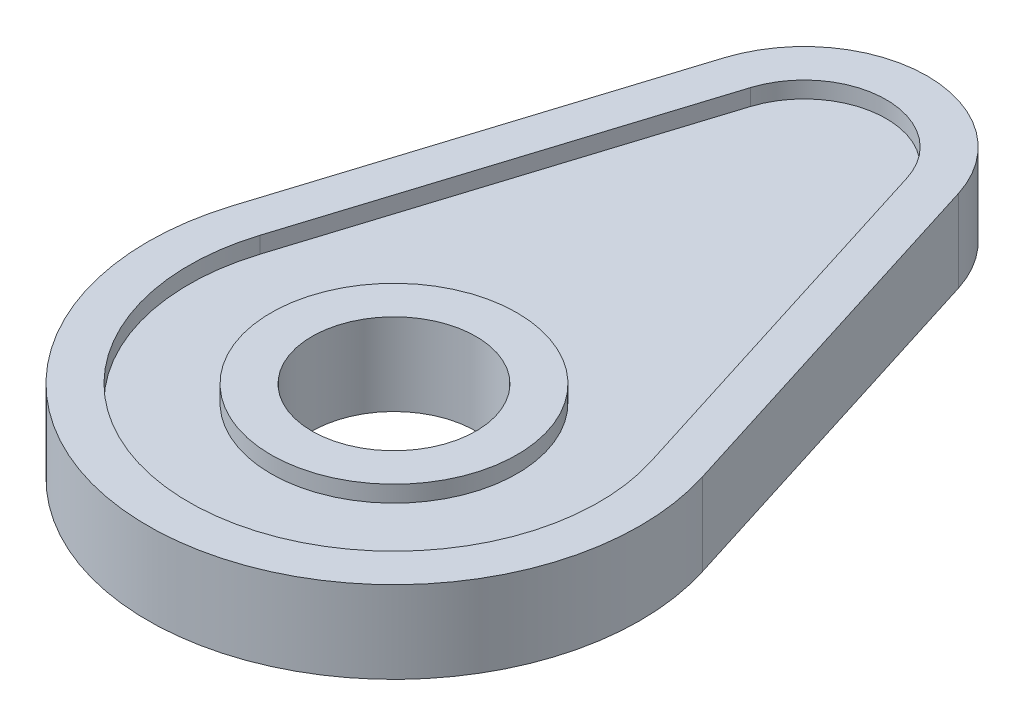
ISO-10303-21;
HEADER;
FILE_DESCRIPTION(('STEP AP214'),'2;1');
FILE_NAME('part.step','',(''),(''),'','','');
FILE_SCHEMA(('AUTOMOTIVE_DESIGN { 1 0 10303 214 1 1 1 1 }'));
ENDSEC;
DATA;
#1=APPLICATION_CONTEXT('core data for automotive mechanical design processes');
#2=APPLICATION_PROTOCOL_DEFINITION('international standard','automotive_design',2000,#1);
#3=PRODUCT_CONTEXT('',#1,'mechanical');
#4=PRODUCT('Part','Part','',(#3));
#5=PRODUCT_RELATED_PRODUCT_CATEGORY('part','',(#4));
#6=PRODUCT_DEFINITION_FORMATION('','',#4);
#7=PRODUCT_DEFINITION_CONTEXT('part definition',#1,'design');
#8=PRODUCT_DEFINITION('design','',#6,#7);
#9=PRODUCT_DEFINITION_SHAPE('','',#8);
#10=(LENGTH_UNIT() NAMED_UNIT(*) SI_UNIT(.MILLI.,.METRE.));
#11=(NAMED_UNIT(*) PLANE_ANGLE_UNIT() SI_UNIT($,.RADIAN.));
#12=(NAMED_UNIT(*) SI_UNIT($,.STERADIAN.) SOLID_ANGLE_UNIT());
#13=UNCERTAINTY_MEASURE_WITH_UNIT(LENGTH_MEASURE(1.E-05),#10,'distance_accuracy_value','');
#14=(GEOMETRIC_REPRESENTATION_CONTEXT(3) GLOBAL_UNCERTAINTY_ASSIGNED_CONTEXT((#13)) GLOBAL_UNIT_ASSIGNED_CONTEXT((#10,
#11,#12)) REPRESENTATION_CONTEXT('',''));
#15=CARTESIAN_POINT('',(0.,0.,0.));
#16=DIRECTION('',(0.,0.,1.));
#17=DIRECTION('',(1.,0.,0.));
#18=AXIS2_PLACEMENT_3D('',#15,#16,#17);
#19=CARTESIAN_POINT('',(0.,3.,-50.));
#20=DIRECTION('',(0.,1.,0.));
#21=DIRECTION('',(0.,0.,1.));
#22=AXIS2_PLACEMENT_3D('',#19,#20,#21);
#23=PLANE('',#22);
#24=CARTESIAN_POINT('',(0.,3.,-50.));
#25=DIRECTION('',(0.,1.,0.));
#26=DIRECTION('',(0.,0.,1.));
#27=AXIS2_PLACEMENT_3D('',#24,#25,#26);
#28=CIRCLE('',#27,9.99999999999999);
#29=CARTESIAN_POINT('',(9.53939201416946,3.,-53.));
#30=VERTEX_POINT('',#29);
#31=CARTESIAN_POINT('',(-9.53939201416946,3.,-53.));
#32=VERTEX_POINT('',#31);
#33=EDGE_CURVE('E185',#30,#32,#28,.T.);
#34=ORIENTED_EDGE('',*,*,#33,.T.);
#35=DIRECTION('',(-0.3,0.,0.953939201416946));
#36=VECTOR('',#35,1.);
#37=CARTESIAN_POINT('',(-9.53939201416946,3.,-53.));
#38=LINE('',#37,#36);
#39=CARTESIAN_POINT('',(-23.8484800354236,3.,-7.50000000000001));
#40=VERTEX_POINT('',#39);
#41=EDGE_CURVE('E189',#32,#40,#38,.T.);
#42=ORIENTED_EDGE('',*,*,#41,.T.);
#43=CARTESIAN_POINT('',(0.,3.,0.));
#44=DIRECTION('',(0.,1.,0.));
#45=DIRECTION('',(0.,0.,1.));
#46=AXIS2_PLACEMENT_3D('',#43,#44,#45);
#47=CIRCLE('',#46,25.);
#48=CARTESIAN_POINT('',(23.8484800354236,3.,-7.5));
#49=VERTEX_POINT('',#48);
#50=EDGE_CURVE('E194',#40,#49,#47,.T.);
#51=ORIENTED_EDGE('',*,*,#50,.T.);
#52=DIRECTION('',(-0.3,0.,-0.953939201416946));
#53=VECTOR('',#52,1.);
#54=CARTESIAN_POINT('',(23.8484800354236,3.,-7.50000000000001));
#55=LINE('',#54,#53);
#56=EDGE_CURVE('E198',#49,#30,#55,.T.);
#57=ORIENTED_EDGE('',*,*,#56,.T.);
#58=EDGE_LOOP('',(#34,#42,#51,#57));
#59=FACE_BOUND('',#58,.T.);
#60=CARTESIAN_POINT('',(0.,3.,0.));
#61=DIRECTION('',(0.,1.,0.));
#62=DIRECTION('',(0.,0.,1.));
#63=AXIS2_PLACEMENT_3D('',#60,#61,#62);
#64=CIRCLE('',#63,15.);
#65=CARTESIAN_POINT('',(0.,3.,15.));
#66=VERTEX_POINT('',#65);
#67=EDGE_CURVE('E161',#66,#66,#64,.T.);
#68=ORIENTED_EDGE('',*,*,#67,.F.);
#69=EDGE_LOOP('',(#68));
#70=FACE_BOUND('',#69,.T.);
#71=ADVANCED_FACE('F41',(#59,#70),#23,.T.);
#72=CARTESIAN_POINT('',(0.,-5.,-50.));
#73=DIRECTION('',(0.,1.,0.));
#74=DIRECTION('',(0.,0.,1.));
#75=AXIS2_PLACEMENT_3D('',#72,#73,#74);
#76=PLANE('',#75);
#77=DIRECTION('',(0.3,0.,-0.953939201416946));
#78=VECTOR('',#77,1.);
#79=CARTESIAN_POINT('',(-28.6181760425084,-5.,-9.));
#80=LINE('',#79,#78);
#81=CARTESIAN_POINT('',(-28.6181760425084,-5.,-9.00000000000001));
#82=VERTEX_POINT('',#81);
#83=CARTESIAN_POINT('',(-14.3090880212542,-5.,-54.5));
#84=VERTEX_POINT('',#83);
#85=EDGE_CURVE('E228',#82,#84,#80,.T.);
#86=ORIENTED_EDGE('',*,*,#85,.T.);
#87=CARTESIAN_POINT('',(0.,-5.,-50.));
#88=DIRECTION('',(0.,1.,0.));
#89=DIRECTION('',(0.,0.,1.));
#90=AXIS2_PLACEMENT_3D('',#87,#88,#89);
#91=CIRCLE('',#90,15.);
#92=CARTESIAN_POINT('',(14.3090880212542,-5.,-54.5));
#93=VERTEX_POINT('',#92);
#94=EDGE_CURVE('E231',#93,#84,#91,.T.);
#95=ORIENTED_EDGE('',*,*,#94,.F.);
#96=DIRECTION('',(0.3,0.,0.953939201416946));
#97=VECTOR('',#96,1.);
#98=CARTESIAN_POINT('',(14.3090880212542,-5.,-54.5));
#99=LINE('',#98,#97);
#100=CARTESIAN_POINT('',(28.6181760425084,-5.,-9.));
#101=VERTEX_POINT('',#100);
#102=EDGE_CURVE('E236',#93,#101,#99,.T.);
#103=ORIENTED_EDGE('',*,*,#102,.T.);
#104=CARTESIAN_POINT('',(0.,-5.,0.));
#105=DIRECTION('',(0.,1.,0.));
#106=DIRECTION('',(0.,0.,1.));
#107=AXIS2_PLACEMENT_3D('',#104,#105,#106);
#108=CIRCLE('',#107,30.);
#109=EDGE_CURVE('E239',#82,#101,#108,.T.);
#110=ORIENTED_EDGE('',*,*,#109,.F.);
#111=EDGE_LOOP('',(#86,#95,#103,#110));
#112=FACE_BOUND('',#111,.T.);
#113=CARTESIAN_POINT('',(0.,-5.,-50.));
#114=DIRECTION('',(0.,1.,0.));
#115=DIRECTION('',(0.,0.,1.));
#116=AXIS2_PLACEMENT_3D('',#113,#114,#115);
#117=CIRCLE('',#116,9.99999999999999);
#118=CARTESIAN_POINT('',(9.53939201416946,-5.,-53.));
#119=VERTEX_POINT('',#118);
#120=CARTESIAN_POINT('',(-9.53939201416946,-5.,-53.));
#121=VERTEX_POINT('',#120);
#122=EDGE_CURVE('E57',#119,#121,#117,.T.);
#123=ORIENTED_EDGE('',*,*,#122,.T.);
#124=DIRECTION('',(-0.3,0.,0.953939201416946));
#125=VECTOR('',#124,1.);
#126=CARTESIAN_POINT('',(-9.53939201416946,-5.,-53.));
#127=LINE('',#126,#125);
#128=CARTESIAN_POINT('',(-23.8484800354236,-5.,-7.50000000000001));
#129=VERTEX_POINT('',#128);
#130=EDGE_CURVE('E154',#121,#129,#127,.T.);
#131=ORIENTED_EDGE('',*,*,#130,.T.);
#132=CARTESIAN_POINT('',(0.,-5.,0.));
#133=DIRECTION('',(0.,1.,0.));
#134=DIRECTION('',(0.,0.,1.));
#135=AXIS2_PLACEMENT_3D('',#132,#133,#134);
#136=CIRCLE('',#135,25.);
#137=CARTESIAN_POINT('',(23.8484800354236,-5.,-7.5));
#138=VERTEX_POINT('',#137);
#139=EDGE_CURVE('E158',#129,#138,#136,.T.);
#140=ORIENTED_EDGE('',*,*,#139,.T.);
#141=DIRECTION('',(-0.3,0.,-0.953939201416946));
#142=VECTOR('',#141,1.);
#143=CARTESIAN_POINT('',(23.8484800354236,-5.,-7.50000000000001));
#144=LINE('',#143,#142);
#145=EDGE_CURVE('E170',#138,#119,#144,.T.);
#146=ORIENTED_EDGE('',*,*,#145,.T.);
#147=EDGE_LOOP('',(#123,#131,#140,#146));
#148=FACE_BOUND('',#147,.T.);
#149=ADVANCED_FACE('F284',(#112,#148),#76,.F.);
#150=CARTESIAN_POINT('',(-28.6181760425084,-5.,-9.));
#151=DIRECTION('',(0.953939201416946,0.,0.3));
#152=DIRECTION('',(0.3,0.,-0.953939201416946));
#153=AXIS2_PLACEMENT_3D('',#150,#151,#152);
#154=PLANE('',#153);
#155=DIRECTION('',(0.3,0.,-0.953939201416946));
#156=VECTOR('',#155,1.);
#157=CARTESIAN_POINT('',(-28.6181760425084,5.,-9.));
#158=LINE('',#157,#156);
#159=CARTESIAN_POINT('',(-28.6181760425084,5.,-9.00000000000001));
#160=VERTEX_POINT('',#159);
#161=CARTESIAN_POINT('',(-14.3090880212542,5.,-54.5));
#162=VERTEX_POINT('',#161);
#163=EDGE_CURVE('E219',#160,#162,#158,.T.);
#164=ORIENTED_EDGE('',*,*,#163,.T.);
#165=DIRECTION('',(0.,1.,0.));
#166=VECTOR('',#165,1.);
#167=CARTESIAN_POINT('',(-14.3090880212542,-5.,-54.5));
#168=LINE('',#167,#166);
#169=EDGE_CURVE('E50',#84,#162,#168,.T.);
#170=ORIENTED_EDGE('',*,*,#169,.F.);
#171=ORIENTED_EDGE('',*,*,#85,.F.);
#172=DIRECTION('',(0.,1.,0.));
#173=VECTOR('',#172,1.);
#174=CARTESIAN_POINT('',(-28.6181760425084,-5.,-9.00000000000001));
#175=LINE('',#174,#173);
#176=EDGE_CURVE('E243',#82,#160,#175,.T.);
#177=ORIENTED_EDGE('',*,*,#176,.T.);
#178=EDGE_LOOP('',(#164,#170,#171,#177));
#179=FACE_BOUND('',#178,.T.);
#180=ADVANCED_FACE('F43',(#179),#154,.F.);
#181=CARTESIAN_POINT('',(0.,-5.,-50.));
#182=DIRECTION('',(0.,1.,0.));
#183=DIRECTION('',(0.,0.,1.));
#184=AXIS2_PLACEMENT_3D('',#181,#182,#183);
#185=CYLINDRICAL_SURFACE('',#184,15.);
#186=CARTESIAN_POINT('',(0.,5.,-50.));
#187=DIRECTION('',(0.,1.,0.));
#188=DIRECTION('',(0.,0.,1.));
#189=AXIS2_PLACEMENT_3D('',#186,#187,#188);
#190=CIRCLE('',#189,15.);
#191=CARTESIAN_POINT('',(14.3090880212542,5.,-54.5));
#192=VERTEX_POINT('',#191);
#193=EDGE_CURVE('E247',#192,#162,#190,.T.);
#194=ORIENTED_EDGE('',*,*,#193,.F.);
#195=DIRECTION('',(0.,1.,0.));
#196=VECTOR('',#195,1.);
#197=CARTESIAN_POINT('',(14.3090880212542,-5.,-54.5));
#198=LINE('',#197,#196);
#199=EDGE_CURVE('E263',#93,#192,#198,.T.);
#200=ORIENTED_EDGE('',*,*,#199,.F.);
#201=ORIENTED_EDGE('',*,*,#94,.T.);
#202=ORIENTED_EDGE('',*,*,#169,.T.);
#203=EDGE_LOOP('',(#194,#200,#201,#202));
#204=FACE_BOUND('',#203,.T.);
#205=ADVANCED_FACE('F269',(#204),#185,.T.);
#206=CARTESIAN_POINT('',(14.3090880212542,-5.,-54.5));
#207=DIRECTION('',(-0.953939201416946,0.,0.3));
#208=DIRECTION('',(0.3,0.,0.953939201416946));
#209=AXIS2_PLACEMENT_3D('',#206,#207,#208);
#210=PLANE('',#209);
#211=DIRECTION('',(0.3,0.,0.953939201416946));
#212=VECTOR('',#211,1.);
#213=CARTESIAN_POINT('',(14.3090880212542,5.,-54.5));
#214=LINE('',#213,#212);
#215=CARTESIAN_POINT('',(28.6181760425084,5.,-9.));
#216=VERTEX_POINT('',#215);
#217=EDGE_CURVE('E251',#192,#216,#214,.T.);
#218=ORIENTED_EDGE('',*,*,#217,.T.);
#219=DIRECTION('',(0.,1.,0.));
#220=VECTOR('',#219,1.);
#221=CARTESIAN_POINT('',(28.6181760425084,-5.,-9.));
#222=LINE('',#221,#220);
#223=EDGE_CURVE('E260',#101,#216,#222,.T.);
#224=ORIENTED_EDGE('',*,*,#223,.F.);
#225=ORIENTED_EDGE('',*,*,#102,.F.);
#226=ORIENTED_EDGE('',*,*,#199,.T.);
#227=EDGE_LOOP('',(#218,#224,#225,#226));
#228=FACE_BOUND('',#227,.T.);
#229=ADVANCED_FACE('F280',(#228),#210,.F.);
#230=CARTESIAN_POINT('',(0.,-5.,0.));
#231=DIRECTION('',(0.,1.,0.));
#232=DIRECTION('',(0.,0.,1.));
#233=AXIS2_PLACEMENT_3D('',#230,#231,#232);
#234=CYLINDRICAL_SURFACE('',#233,30.);
#235=CARTESIAN_POINT('',(0.,5.,0.));
#236=DIRECTION('',(0.,1.,0.));
#237=DIRECTION('',(0.,0.,1.));
#238=AXIS2_PLACEMENT_3D('',#235,#236,#237);
#239=CIRCLE('',#238,30.);
#240=EDGE_CURVE('E232',#160,#216,#239,.T.);
#241=ORIENTED_EDGE('',*,*,#240,.F.);
#242=ORIENTED_EDGE('',*,*,#176,.F.);
#243=ORIENTED_EDGE('',*,*,#109,.T.);
#244=ORIENTED_EDGE('',*,*,#223,.T.);
#245=EDGE_LOOP('',(#241,#242,#243,#244));
#246=FACE_BOUND('',#245,.T.);
#247=ADVANCED_FACE('F287',(#246),#234,.T.);
#248=CARTESIAN_POINT('',(0.,5.,-50.));
#249=DIRECTION('',(0.,1.,0.));
#250=DIRECTION('',(0.,0.,1.));
#251=AXIS2_PLACEMENT_3D('',#248,#249,#250);
#252=PLANE('',#251);
#253=CARTESIAN_POINT('',(0.,5.,-50.));
#254=DIRECTION('',(0.,1.,0.));
#255=DIRECTION('',(0.,0.,1.));
#256=AXIS2_PLACEMENT_3D('',#253,#254,#255);
#257=CIRCLE('',#256,9.99999999999999);
#258=CARTESIAN_POINT('',(9.53939201416946,5.,-53.));
#259=VERTEX_POINT('',#258);
#260=CARTESIAN_POINT('',(-9.53939201416946,5.,-53.));
#261=VERTEX_POINT('',#260);
#262=EDGE_CURVE('E65',#259,#261,#257,.T.);
#263=ORIENTED_EDGE('',*,*,#262,.F.);
#264=DIRECTION('',(-0.3,0.,-0.953939201416946));
#265=VECTOR('',#264,1.);
#266=CARTESIAN_POINT('',(23.8484800354236,5.,-7.50000000000001));
#267=LINE('',#266,#265);
#268=CARTESIAN_POINT('',(23.8484800354236,5.,-7.5));
#269=VERTEX_POINT('',#268);
#270=EDGE_CURVE('E190',#269,#259,#267,.T.);
#271=ORIENTED_EDGE('',*,*,#270,.F.);
#272=CARTESIAN_POINT('',(0.,5.,0.));
#273=DIRECTION('',(0.,1.,0.));
#274=DIRECTION('',(0.,0.,1.));
#275=AXIS2_PLACEMENT_3D('',#272,#273,#274);
#276=CIRCLE('',#275,25.);
#277=CARTESIAN_POINT('',(-23.8484800354236,5.,-7.50000000000001));
#278=VERTEX_POINT('',#277);
#279=EDGE_CURVE('E209',#278,#269,#276,.T.);
#280=ORIENTED_EDGE('',*,*,#279,.F.);
#281=DIRECTION('',(-0.3,0.,0.953939201416946));
#282=VECTOR('',#281,1.);
#283=CARTESIAN_POINT('',(-9.53939201416946,5.,-53.));
#284=LINE('',#283,#282);
#285=EDGE_CURVE('E205',#261,#278,#284,.T.);
#286=ORIENTED_EDGE('',*,*,#285,.F.);
#287=EDGE_LOOP('',(#263,#271,#280,#286));
#288=FACE_BOUND('',#287,.T.);
#289=ORIENTED_EDGE('',*,*,#163,.F.);
#290=ORIENTED_EDGE('',*,*,#240,.T.);
#291=ORIENTED_EDGE('',*,*,#217,.F.);
#292=ORIENTED_EDGE('',*,*,#193,.T.);
#293=EDGE_LOOP('',(#289,#290,#291,#292));
#294=FACE_BOUND('',#293,.T.);
#295=ADVANCED_FACE('F277',(#288,#294),#252,.T.);
#296=CARTESIAN_POINT('',(0.,3.,-50.));
#297=DIRECTION('',(0.,1.,0.));
#298=DIRECTION('',(0.,0.,1.));
#299=AXIS2_PLACEMENT_3D('',#296,#297,#298);
#300=CYLINDRICAL_SURFACE('',#299,9.99999999999999);
#301=ORIENTED_EDGE('',*,*,#262,.T.);
#302=DIRECTION('',(0.,1.,0.));
#303=VECTOR('',#302,1.);
#304=CARTESIAN_POINT('',(-9.53939201416946,3.,-53.));
#305=LINE('',#304,#303);
#306=EDGE_CURVE('E202',#32,#261,#305,.T.);
#307=ORIENTED_EDGE('',*,*,#306,.F.);
#308=ORIENTED_EDGE('',*,*,#33,.F.);
#309=DIRECTION('',(0.,1.,0.));
#310=VECTOR('',#309,1.);
#311=CARTESIAN_POINT('',(9.53939201416946,3.,-53.));
#312=LINE('',#311,#310);
#313=EDGE_CURVE('E216',#30,#259,#312,.T.);
#314=ORIENTED_EDGE('',*,*,#313,.T.);
#315=EDGE_LOOP('',(#301,#307,#308,#314));
#316=FACE_BOUND('',#315,.T.);
#317=ADVANCED_FACE('F294',(#316),#300,.F.);
#318=CARTESIAN_POINT('',(23.8484800354236,3.,-7.50000000000001));
#319=DIRECTION('',(0.953939201416946,0.,-0.3));
#320=DIRECTION('',(-0.3,0.,-0.953939201416946));
#321=AXIS2_PLACEMENT_3D('',#318,#319,#320);
#322=PLANE('',#321);
#323=ORIENTED_EDGE('',*,*,#270,.T.);
#324=ORIENTED_EDGE('',*,*,#313,.F.);
#325=ORIENTED_EDGE('',*,*,#56,.F.);
#326=DIRECTION('',(0.,1.,0.));
#327=VECTOR('',#326,1.);
#328=CARTESIAN_POINT('',(23.8484800354236,3.,-7.5));
#329=LINE('',#328,#327);
#330=EDGE_CURVE('E220',#49,#269,#329,.T.);
#331=ORIENTED_EDGE('',*,*,#330,.T.);
#332=EDGE_LOOP('',(#323,#324,#325,#331));
#333=FACE_BOUND('',#332,.T.);
#334=ADVANCED_FACE('F309',(#333),#322,.F.);
#335=CARTESIAN_POINT('',(0.,3.,0.));
#336=DIRECTION('',(0.,1.,0.));
#337=DIRECTION('',(0.,0.,1.));
#338=AXIS2_PLACEMENT_3D('',#335,#336,#337);
#339=CYLINDRICAL_SURFACE('',#338,25.);
#340=ORIENTED_EDGE('',*,*,#279,.T.);
#341=ORIENTED_EDGE('',*,*,#330,.F.);
#342=ORIENTED_EDGE('',*,*,#50,.F.);
#343=DIRECTION('',(0.,1.,0.));
#344=VECTOR('',#343,1.);
#345=CARTESIAN_POINT('',(-23.8484800354236,3.,-7.50000000000001));
#346=LINE('',#345,#344);
#347=EDGE_CURVE('E223',#40,#278,#346,.T.);
#348=ORIENTED_EDGE('',*,*,#347,.T.);
#349=EDGE_LOOP('',(#340,#341,#342,#348));
#350=FACE_BOUND('',#349,.T.);
#351=ADVANCED_FACE('F312',(#350),#339,.F.);
#352=CARTESIAN_POINT('',(-9.53939201416946,3.,-53.));
#353=DIRECTION('',(-0.953939201416946,0.,-0.3));
#354=DIRECTION('',(-0.3,0.,0.953939201416946));
#355=AXIS2_PLACEMENT_3D('',#352,#353,#354);
#356=PLANE('',#355);
#357=ORIENTED_EDGE('',*,*,#285,.T.);
#358=ORIENTED_EDGE('',*,*,#347,.F.);
#359=ORIENTED_EDGE('',*,*,#41,.F.);
#360=ORIENTED_EDGE('',*,*,#306,.T.);
#361=EDGE_LOOP('',(#357,#358,#359,#360));
#362=FACE_BOUND('',#361,.T.);
#363=ADVANCED_FACE('F316',(#362),#356,.F.);
#364=CARTESIAN_POINT('',(0.,-3.,-50.));
#365=DIRECTION('',(0.,-1.,0.));
#366=DIRECTION('',(0.,0.,-1.));
#367=AXIS2_PLACEMENT_3D('',#364,#365,#366);
#368=CYLINDRICAL_SURFACE('',#367,9.99999999999999);
#369=ORIENTED_EDGE('',*,*,#122,.F.);
#370=DIRECTION('',(0.,-1.,0.));
#371=VECTOR('',#370,1.);
#372=CARTESIAN_POINT('',(9.53939201416946,-3.,-53.));
#373=LINE('',#372,#371);
#374=CARTESIAN_POINT('',(9.53939201416946,-3.,-53.));
#375=VERTEX_POINT('',#374);
#376=EDGE_CURVE('E136',#375,#119,#373,.T.);
#377=ORIENTED_EDGE('',*,*,#376,.F.);
#378=CARTESIAN_POINT('',(0.,-3.,-50.));
#379=DIRECTION('',(0.,1.,0.));
#380=DIRECTION('',(0.,0.,1.));
#381=AXIS2_PLACEMENT_3D('',#378,#379,#380);
#382=CIRCLE('',#381,9.99999999999999);
#383=CARTESIAN_POINT('',(-9.53939201416946,-3.,-53.));
#384=VERTEX_POINT('',#383);
#385=EDGE_CURVE('E144',#375,#384,#382,.T.);
#386=ORIENTED_EDGE('',*,*,#385,.T.);
#387=DIRECTION('',(0.,-1.,0.));
#388=VECTOR('',#387,1.);
#389=CARTESIAN_POINT('',(-9.53939201416946,-3.,-53.));
#390=LINE('',#389,#388);
#391=EDGE_CURVE('E177',#384,#121,#390,.T.);
#392=ORIENTED_EDGE('',*,*,#391,.T.);
#393=EDGE_LOOP('',(#369,#377,#386,#392));
#394=FACE_BOUND('',#393,.T.);
#395=ADVANCED_FACE('F147',(#394),#368,.F.);
#396=CARTESIAN_POINT('',(-9.53939201416946,-3.,-53.));
#397=DIRECTION('',(0.953939201416946,0.,0.3));
#398=DIRECTION('',(0.3,0.,-0.953939201416946));
#399=AXIS2_PLACEMENT_3D('',#396,#397,#398);
#400=PLANE('',#399);
#401=ORIENTED_EDGE('',*,*,#130,.F.);
#402=ORIENTED_EDGE('',*,*,#391,.F.);
#403=DIRECTION('',(-0.3,0.,0.953939201416946));
#404=VECTOR('',#403,1.);
#405=CARTESIAN_POINT('',(-9.53939201416946,-3.,-53.));
#406=LINE('',#405,#404);
#407=CARTESIAN_POINT('',(-23.8484800354236,-3.,-7.50000000000001));
#408=VERTEX_POINT('',#407);
#409=EDGE_CURVE('E150',#384,#408,#406,.T.);
#410=ORIENTED_EDGE('',*,*,#409,.T.);
#411=DIRECTION('',(0.,-1.,0.));
#412=VECTOR('',#411,1.);
#413=CARTESIAN_POINT('',(-23.8484800354236,-3.,-7.50000000000001));
#414=LINE('',#413,#412);
#415=EDGE_CURVE('E180',#408,#129,#414,.T.);
#416=ORIENTED_EDGE('',*,*,#415,.T.);
#417=EDGE_LOOP('',(#401,#402,#410,#416));
#418=FACE_BOUND('',#417,.T.);
#419=ADVANCED_FACE('F345',(#418),#400,.T.);
#420=CARTESIAN_POINT('',(0.,-3.,0.));
#421=DIRECTION('',(0.,-1.,0.));
#422=DIRECTION('',(0.,0.,-1.));
#423=AXIS2_PLACEMENT_3D('',#420,#421,#422);
#424=CYLINDRICAL_SURFACE('',#423,25.);
#425=ORIENTED_EDGE('',*,*,#139,.F.);
#426=ORIENTED_EDGE('',*,*,#415,.F.);
#427=CARTESIAN_POINT('',(0.,-3.,0.));
#428=DIRECTION('',(0.,1.,0.));
#429=DIRECTION('',(0.,0.,1.));
#430=AXIS2_PLACEMENT_3D('',#427,#428,#429);
#431=CIRCLE('',#430,25.);
#432=CARTESIAN_POINT('',(23.8484800354236,-3.,-7.5));
#433=VERTEX_POINT('',#432);
#434=EDGE_CURVE('E143',#408,#433,#431,.T.);
#435=ORIENTED_EDGE('',*,*,#434,.T.);
#436=DIRECTION('',(0.,-1.,0.));
#437=VECTOR('',#436,1.);
#438=CARTESIAN_POINT('',(23.8484800354236,-3.,-7.5));
#439=LINE('',#438,#437);
#440=EDGE_CURVE('E138',#433,#138,#439,.T.);
#441=ORIENTED_EDGE('',*,*,#440,.T.);
#442=EDGE_LOOP('',(#425,#426,#435,#441));
#443=FACE_BOUND('',#442,.T.);
#444=ADVANCED_FACE('F351',(#443),#424,.F.);
#445=CARTESIAN_POINT('',(23.8484800354236,-3.,-7.50000000000001));
#446=DIRECTION('',(-0.953939201416946,0.,0.3));
#447=DIRECTION('',(0.3,0.,0.953939201416946));
#448=AXIS2_PLACEMENT_3D('',#445,#446,#447);
#449=PLANE('',#448);
#450=ORIENTED_EDGE('',*,*,#145,.F.);
#451=ORIENTED_EDGE('',*,*,#440,.F.);
#452=DIRECTION('',(-0.3,0.,-0.953939201416946));
#453=VECTOR('',#452,1.);
#454=CARTESIAN_POINT('',(23.8484800354236,-3.,-7.50000000000001));
#455=LINE('',#454,#453);
#456=EDGE_CURVE('E133',#433,#375,#455,.T.);
#457=ORIENTED_EDGE('',*,*,#456,.T.);
#458=ORIENTED_EDGE('',*,*,#376,.T.);
#459=EDGE_LOOP('',(#450,#451,#457,#458));
#460=FACE_BOUND('',#459,.T.);
#461=ADVANCED_FACE('F135',(#460),#449,.T.);
#462=CARTESIAN_POINT('',(0.,-3.,-50.));
#463=DIRECTION('',(0.,-1.,0.));
#464=DIRECTION('',(0.,0.,1.));
#465=AXIS2_PLACEMENT_3D('',#462,#463,#464);
#466=PLANE('',#465);
#467=CARTESIAN_POINT('',(0.,-3.,0.));
#468=DIRECTION('',(0.,-1.,0.));
#469=DIRECTION('',(0.,0.,-1.));
#470=AXIS2_PLACEMENT_3D('',#467,#468,#469);
#471=CIRCLE('',#470,15.);
#472=CARTESIAN_POINT('',(0.,-3.,-15.));
#473=VERTEX_POINT('',#472);
#474=EDGE_CURVE('E11',#473,#473,#471,.T.);
#475=ORIENTED_EDGE('',*,*,#474,.F.);
#476=EDGE_LOOP('',(#475));
#477=FACE_BOUND('',#476,.T.);
#478=ORIENTED_EDGE('',*,*,#385,.F.);
#479=ORIENTED_EDGE('',*,*,#456,.F.);
#480=ORIENTED_EDGE('',*,*,#434,.F.);
#481=ORIENTED_EDGE('',*,*,#409,.F.);
#482=EDGE_LOOP('',(#478,#479,#480,#481));
#483=FACE_BOUND('',#482,.T.);
#484=ADVANCED_FACE('F152',(#477,#483),#466,.T.);
#485=CARTESIAN_POINT('',(0.,-5.,0.));
#486=DIRECTION('',(0.,1.,0.));
#487=DIRECTION('',(0.,0.,1.));
#488=AXIS2_PLACEMENT_3D('',#485,#486,#487);
#489=CYLINDRICAL_SURFACE('',#488,10.);
#490=CARTESIAN_POINT('',(0.,5.,0.));
#491=DIRECTION('',(0.,1.,0.));
#492=DIRECTION('',(0.,0.,1.));
#493=AXIS2_PLACEMENT_3D('',#490,#491,#492);
#494=CIRCLE('',#493,10.);
#495=CARTESIAN_POINT('',(0.,5.,10.));
#496=VERTEX_POINT('',#495);
#497=EDGE_CURVE('E495',#496,#496,#494,.T.);
#498=ORIENTED_EDGE('',*,*,#497,.T.);
#499=EDGE_LOOP('',(#498));
#500=FACE_BOUND('',#499,.T.);
#501=CARTESIAN_POINT('',(0.,-5.,0.));
#502=DIRECTION('',(0.,1.,0.));
#503=DIRECTION('',(0.,0.,1.));
#504=AXIS2_PLACEMENT_3D('',#501,#502,#503);
#505=CIRCLE('',#504,10.);
#506=CARTESIAN_POINT('',(0.,-5.,10.));
#507=VERTEX_POINT('',#506);
#508=EDGE_CURVE('E490',#507,#507,#505,.T.);
#509=ORIENTED_EDGE('',*,*,#508,.F.);
#510=EDGE_LOOP('',(#509));
#511=FACE_BOUND('',#510,.T.);
#512=ADVANCED_FACE('F372',(#500,#511),#489,.F.);
#513=CARTESIAN_POINT('',(0.,5.,0.));
#514=DIRECTION('',(0.,1.,0.));
#515=DIRECTION('',(0.,0.,1.));
#516=AXIS2_PLACEMENT_3D('',#513,#514,#515);
#517=PLANE('',#516);
#518=CARTESIAN_POINT('',(0.,5.,0.));
#519=DIRECTION('',(0.,1.,0.));
#520=DIRECTION('',(0.,0.,1.));
#521=AXIS2_PLACEMENT_3D('',#518,#519,#520);
#522=CIRCLE('',#521,15.);
#523=CARTESIAN_POINT('',(0.,5.,15.));
#524=VERTEX_POINT('',#523);
#525=EDGE_CURVE('E171',#524,#524,#522,.T.);
#526=ORIENTED_EDGE('',*,*,#525,.T.);
#527=EDGE_LOOP('',(#526));
#528=FACE_BOUND('',#527,.T.);
#529=ORIENTED_EDGE('',*,*,#497,.F.);
#530=EDGE_LOOP('',(#529));
#531=FACE_BOUND('',#530,.T.);
#532=ADVANCED_FACE('F379',(#528,#531),#517,.T.);
#533=CARTESIAN_POINT('',(0.,5.,0.));
#534=DIRECTION('',(0.,-1.,0.));
#535=DIRECTION('',(0.,0.,-1.));
#536=AXIS2_PLACEMENT_3D('',#533,#534,#535);
#537=CYLINDRICAL_SURFACE('',#536,15.);
#538=ORIENTED_EDGE('',*,*,#525,.F.);
#539=EDGE_LOOP('',(#538));
#540=FACE_BOUND('',#539,.T.);
#541=ORIENTED_EDGE('',*,*,#67,.T.);
#542=EDGE_LOOP('',(#541));
#543=FACE_BOUND('',#542,.T.);
#544=ADVANCED_FACE('F388',(#540,#543),#537,.T.);
#545=CARTESIAN_POINT('',(0.,-5.,0.));
#546=DIRECTION('',(0.,1.,0.));
#547=DIRECTION('',(0.,0.,1.));
#548=AXIS2_PLACEMENT_3D('',#545,#546,#547);
#549=CYLINDRICAL_SURFACE('',#548,15.);
#550=CARTESIAN_POINT('',(0.,-5.,0.));
#551=DIRECTION('',(0.,1.,0.));
#552=DIRECTION('',(0.,0.,1.));
#553=AXIS2_PLACEMENT_3D('',#550,#551,#552);
#554=CIRCLE('',#553,15.);
#555=CARTESIAN_POINT('',(0.,-5.,15.));
#556=VERTEX_POINT('',#555);
#557=EDGE_CURVE('E493',#556,#556,#554,.T.);
#558=ORIENTED_EDGE('',*,*,#557,.T.);
#559=EDGE_LOOP('',(#558));
#560=FACE_BOUND('',#559,.T.);
#561=ORIENTED_EDGE('',*,*,#474,.T.);
#562=EDGE_LOOP('',(#561));
#563=FACE_BOUND('',#562,.T.);
#564=ADVANCED_FACE('F396',(#560,#563),#549,.T.);
#565=CARTESIAN_POINT('',(0.,-5.,0.));
#566=DIRECTION('',(0.,-1.,0.));
#567=DIRECTION('',(0.,0.,1.));
#568=AXIS2_PLACEMENT_3D('',#565,#566,#567);
#569=PLANE('',#568);
#570=ORIENTED_EDGE('',*,*,#508,.T.);
#571=EDGE_LOOP('',(#570));
#572=FACE_BOUND('',#571,.T.);
#573=ORIENTED_EDGE('',*,*,#557,.F.);
#574=EDGE_LOOP('',(#573));
#575=FACE_BOUND('',#574,.T.);
#576=ADVANCED_FACE('F403',(#572,#575),#569,.T.);
#577=CLOSED_SHELL('',(#71,#149,#180,#205,#229,#247,#295,#317,#334,#351,#363,#395,#419,#444,#461,
#484,#512,#532,#544,#564,#576));
#578=MANIFOLD_SOLID_BREP('B2',#577);
#579=ADVANCED_BREP_SHAPE_REPRESENTATION('',(#18,#578),#14);
#580=SHAPE_DEFINITION_REPRESENTATION(#9,#579);
ENDSEC;
END-ISO-10303-21;
